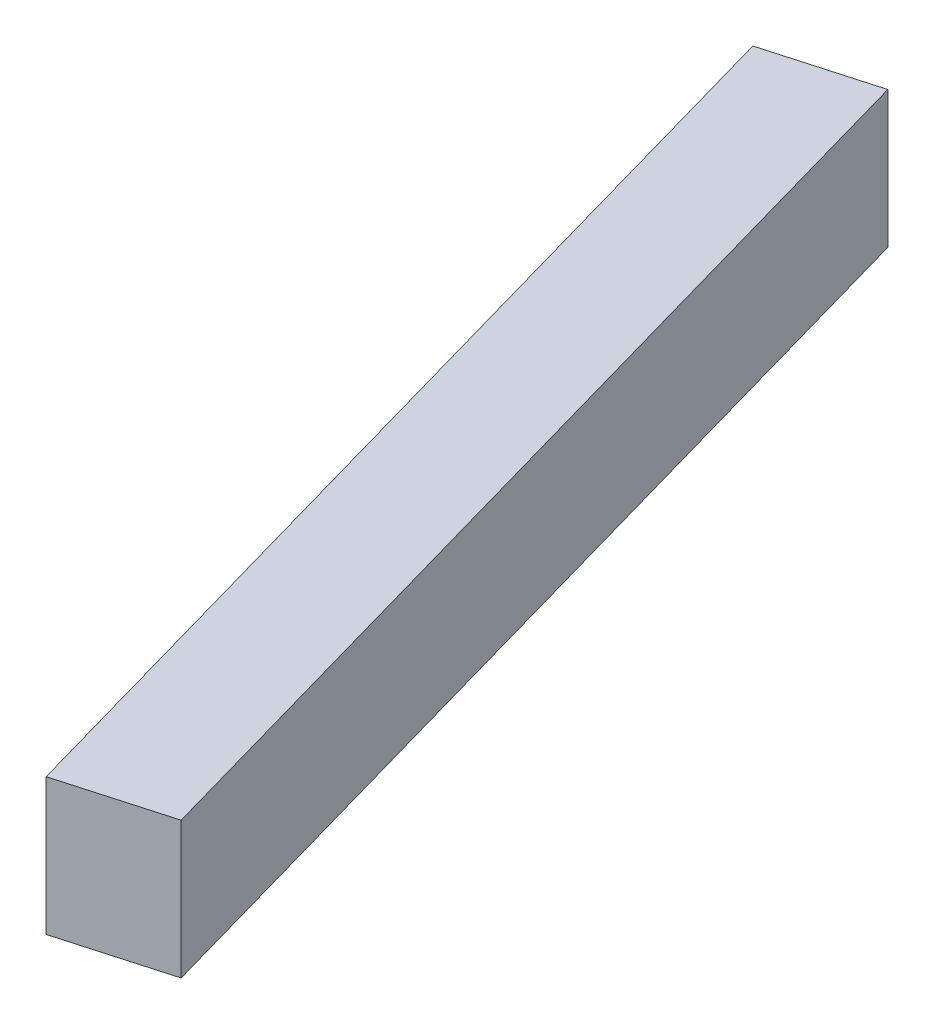
ISO-10303-21;
HEADER;
FILE_DESCRIPTION(('STEP AP214'),'2;1');
FILE_NAME('part.step','',(''),(''),'','','');
FILE_SCHEMA(('AUTOMOTIVE_DESIGN { 1 0 10303 214 1 1 1 1 }'));
ENDSEC;
DATA;
#1=APPLICATION_CONTEXT('core data for automotive mechanical design processes');
#2=APPLICATION_PROTOCOL_DEFINITION('international standard','automotive_design',2000,#1);
#3=PRODUCT_CONTEXT('',#1,'mechanical');
#4=PRODUCT('Part','Part','',(#3));
#5=PRODUCT_RELATED_PRODUCT_CATEGORY('part','',(#4));
#6=PRODUCT_DEFINITION_FORMATION('','',#4);
#7=PRODUCT_DEFINITION_CONTEXT('part definition',#1,'design');
#8=PRODUCT_DEFINITION('design','',#6,#7);
#9=PRODUCT_DEFINITION_SHAPE('','',#8);
#10=(LENGTH_UNIT() NAMED_UNIT(*) SI_UNIT(.MILLI.,.METRE.));
#11=(NAMED_UNIT(*) PLANE_ANGLE_UNIT() SI_UNIT($,.RADIAN.));
#12=(NAMED_UNIT(*) SI_UNIT($,.STERADIAN.) SOLID_ANGLE_UNIT());
#13=UNCERTAINTY_MEASURE_WITH_UNIT(LENGTH_MEASURE(1.E-05),#10,'distance_accuracy_value','');
#14=(GEOMETRIC_REPRESENTATION_CONTEXT(3) GLOBAL_UNCERTAINTY_ASSIGNED_CONTEXT((#13)) GLOBAL_UNIT_ASSIGNED_CONTEXT((#10,
#11,#12)) REPRESENTATION_CONTEXT('',''));
#15=CARTESIAN_POINT('',(0.,0.,0.));
#16=DIRECTION('',(0.,0.,1.));
#17=DIRECTION('',(1.,0.,0.));
#18=AXIS2_PLACEMENT_3D('',#15,#16,#17);
#19=CARTESIAN_POINT('',(-5.00292568764494,7.874,-17.2878432945507));
#20=DIRECTION('',(0.962116546847749,0.,-0.272638497431604));
#21=DIRECTION('',(-0.272638497431604,0.,-0.962116546847749));
#22=AXIS2_PLACEMENT_3D('',#19,#20,#21);
#23=PLANE('',#22);
#24=DIRECTION('',(0.,1.,0.));
#25=VECTOR('',#24,1.);
#26=CARTESIAN_POINT('',(-5.00292568764494,7.874,-17.2878432945507));
#27=LINE('',#26,#25);
#28=CARTESIAN_POINT('',(-5.00292568764494,7.62,-17.2878432945507));
#29=VERTEX_POINT('',#28);
#30=CARTESIAN_POINT('',(-5.00292568764494,7.874,-17.2878432945507));
#31=VERTEX_POINT('',#30);
#32=EDGE_CURVE('E20',#29,#31,#27,.T.);
#33=ORIENTED_EDGE('',*,*,#32,.T.);
#34=DIRECTION('',(-0.272638497431596,0.,-0.962116546847752));
#35=VECTOR('',#34,1.);
#36=CARTESIAN_POINT('',(-5.00292568764494,7.874,-17.2878432945507));
#37=LINE('',#36,#35);
#38=CARTESIAN_POINT('',(-5.52230202525214,7.874,-19.1206753162957));
#39=VERTEX_POINT('',#38);
#40=EDGE_CURVE('E55',#31,#39,#37,.T.);
#41=ORIENTED_EDGE('',*,*,#40,.T.);
#42=DIRECTION('',(0.,1.,0.));
#43=VECTOR('',#42,1.);
#44=CARTESIAN_POINT('',(-5.52230202525214,7.874,-19.1206753162957));
#45=LINE('',#44,#43);
#46=CARTESIAN_POINT('',(-5.52230202525215,7.62,-19.1206753162957));
#47=VERTEX_POINT('',#46);
#48=EDGE_CURVE('E76',#39,#47,#45,.F.);
#49=ORIENTED_EDGE('',*,*,#48,.T.);
#50=DIRECTION('',(-0.272638497431596,0.,-0.962116546847752));
#51=VECTOR('',#50,1.);
#52=CARTESIAN_POINT('',(-5.00292568764494,7.62,-17.2878432945507));
#53=LINE('',#52,#51);
#54=EDGE_CURVE('E58',#29,#47,#53,.T.);
#55=ORIENTED_EDGE('',*,*,#54,.F.);
#56=EDGE_LOOP('',(#33,#41,#49,#55));
#57=FACE_BOUND('',#56,.T.);
#58=ADVANCED_FACE('F17',(#57),#23,.F.);
#59=CARTESIAN_POINT('',(-5.00292568764494,7.874,-17.2878432945507));
#60=DIRECTION('',(-0.272638497431619,0.,-0.962116546847745));
#61=DIRECTION('',(-0.962116546847745,0.,0.272638497431619));
#62=AXIS2_PLACEMENT_3D('',#59,#60,#61);
#63=PLANE('',#62);
#64=DIRECTION('',(0.,1.,0.));
#65=VECTOR('',#64,1.);
#66=CARTESIAN_POINT('',(-4.80742360532547,7.874,-17.3432434372288));
#67=LINE('',#66,#65);
#68=CARTESIAN_POINT('',(-4.80742360532547,7.62,-17.3432434372288));
#69=VERTEX_POINT('',#68);
#70=CARTESIAN_POINT('',(-4.80742360532547,7.874,-17.3432434372288));
#71=VERTEX_POINT('',#70);
#72=EDGE_CURVE('E73',#69,#71,#67,.T.);
#73=ORIENTED_EDGE('',*,*,#72,.T.);
#74=DIRECTION('',(-0.962116546847756,0.,0.272638497431582));
#75=VECTOR('',#74,1.);
#76=CARTESIAN_POINT('',(-4.80742360532547,7.874,-17.3432434372288));
#77=LINE('',#76,#75);
#78=EDGE_CURVE('E63',#71,#31,#77,.T.);
#79=ORIENTED_EDGE('',*,*,#78,.T.);
#80=ORIENTED_EDGE('',*,*,#32,.F.);
#81=DIRECTION('',(-0.962116546847756,0.,0.272638497431582));
#82=VECTOR('',#81,1.);
#83=CARTESIAN_POINT('',(-4.80742360532547,7.62,-17.3432434372288));
#84=LINE('',#83,#82);
#85=EDGE_CURVE('E80',#69,#29,#84,.T.);
#86=ORIENTED_EDGE('',*,*,#85,.F.);
#87=EDGE_LOOP('',(#73,#79,#80,#86));
#88=FACE_BOUND('',#87,.T.);
#89=ADVANCED_FACE('F72',(#88),#63,.F.);
#90=CARTESIAN_POINT('',(-5.00292568764494,7.874,-17.2878432945507));
#91=DIRECTION('',(0.,-1.,0.));
#92=DIRECTION('',(0.,0.,-1.));
#93=AXIS2_PLACEMENT_3D('',#90,#91,#92);
#94=PLANE('',#93);
#95=ORIENTED_EDGE('',*,*,#78,.F.);
#96=DIRECTION('',(0.272638497431603,0.,0.962116546847749));
#97=VECTOR('',#96,1.);
#98=CARTESIAN_POINT('',(-4.80742360532547,7.874,-17.3432434372288));
#99=LINE('',#98,#97);
#100=CARTESIAN_POINT('',(-5.32679994301701,7.874,-19.1760754592714));
#101=VERTEX_POINT('',#100);
#102=EDGE_CURVE('E83',#71,#101,#99,.F.);
#103=ORIENTED_EDGE('',*,*,#102,.T.);
#104=DIRECTION('',(0.962116546432704,0.,-0.272638498896262));
#105=VECTOR('',#104,1.);
#106=CARTESIAN_POINT('',(-5.52230202525214,7.874,-19.1206753162957));
#107=LINE('',#106,#105);
#108=EDGE_CURVE('E69',#101,#39,#107,.F.);
#109=ORIENTED_EDGE('',*,*,#108,.T.);
#110=ORIENTED_EDGE('',*,*,#40,.F.);
#111=EDGE_LOOP('',(#95,#103,#109,#110));
#112=FACE_BOUND('',#111,.T.);
#113=ADVANCED_FACE('F66',(#112),#94,.F.);
#114=CARTESIAN_POINT('',(-5.52230202525214,7.874,-19.1206753162957));
#115=DIRECTION('',(0.272638498896262,0.,0.962116546432704));
#116=DIRECTION('',(0.962116546432704,0.,-0.272638498896262));
#117=AXIS2_PLACEMENT_3D('',#114,#115,#116);
#118=PLANE('',#117);
#119=ORIENTED_EDGE('',*,*,#48,.F.);
#120=ORIENTED_EDGE('',*,*,#108,.F.);
#121=DIRECTION('',(0.,1.,0.));
#122=VECTOR('',#121,1.);
#123=CARTESIAN_POINT('',(-5.32679994301702,7.874,-19.1760754592714));
#124=LINE('',#123,#122);
#125=CARTESIAN_POINT('',(-5.32679994301701,7.62,-19.1760754592714));
#126=VERTEX_POINT('',#125);
#127=EDGE_CURVE('E26',#101,#126,#124,.F.);
#128=ORIENTED_EDGE('',*,*,#127,.T.);
#129=DIRECTION('',(0.96211654643273,0.,-0.27263849889617));
#130=VECTOR('',#129,1.);
#131=CARTESIAN_POINT('',(-5.52230202525214,7.62,-19.1206753162957));
#132=LINE('',#131,#130);
#133=EDGE_CURVE('E34',#47,#126,#132,.T.);
#134=ORIENTED_EDGE('',*,*,#133,.F.);
#135=EDGE_LOOP('',(#119,#120,#128,#134));
#136=FACE_BOUND('',#135,.T.);
#137=ADVANCED_FACE('F88',(#136),#118,.F.);
#138=CARTESIAN_POINT('',(-5.00292568764494,7.62,-17.2878432945507));
#139=DIRECTION('',(0.,-1.,0.));
#140=DIRECTION('',(0.,0.,-1.));
#141=AXIS2_PLACEMENT_3D('',#138,#139,#140);
#142=PLANE('',#141);
#143=DIRECTION('',(0.272638497431603,0.,0.962116546847749));
#144=VECTOR('',#143,1.);
#145=CARTESIAN_POINT('',(-4.80742360532547,7.62,-17.3432434372288));
#146=LINE('',#145,#144);
#147=EDGE_CURVE('E11',#126,#69,#146,.T.);
#148=ORIENTED_EDGE('',*,*,#147,.T.);
#149=ORIENTED_EDGE('',*,*,#85,.T.);
#150=ORIENTED_EDGE('',*,*,#54,.T.);
#151=ORIENTED_EDGE('',*,*,#133,.T.);
#152=EDGE_LOOP('',(#148,#149,#150,#151));
#153=FACE_BOUND('',#152,.T.);
#154=ADVANCED_FACE('F91',(#153),#142,.T.);
#155=CARTESIAN_POINT('',(-4.80742360532547,7.874,-17.3432434372288));
#156=DIRECTION('',(-0.962116546847749,0.,0.272638497431603));
#157=DIRECTION('',(0.272638497431603,0.,0.962116546847749));
#158=AXIS2_PLACEMENT_3D('',#155,#156,#157);
#159=PLANE('',#158);
#160=ORIENTED_EDGE('',*,*,#127,.F.);
#161=ORIENTED_EDGE('',*,*,#102,.F.);
#162=ORIENTED_EDGE('',*,*,#72,.F.);
#163=ORIENTED_EDGE('',*,*,#147,.F.);
#164=EDGE_LOOP('',(#160,#161,#162,#163));
#165=FACE_BOUND('',#164,.T.);
#166=ADVANCED_FACE('F90',(#165),#159,.F.);
#167=CLOSED_SHELL('',(#58,#89,#113,#137,#154,#166));
#168=MANIFOLD_SOLID_BREP('B1',#167);
#169=ADVANCED_BREP_SHAPE_REPRESENTATION('',(#18,#168),#14);
#170=SHAPE_DEFINITION_REPRESENTATION(#9,#169);
ENDSEC;
END-ISO-10303-21;
